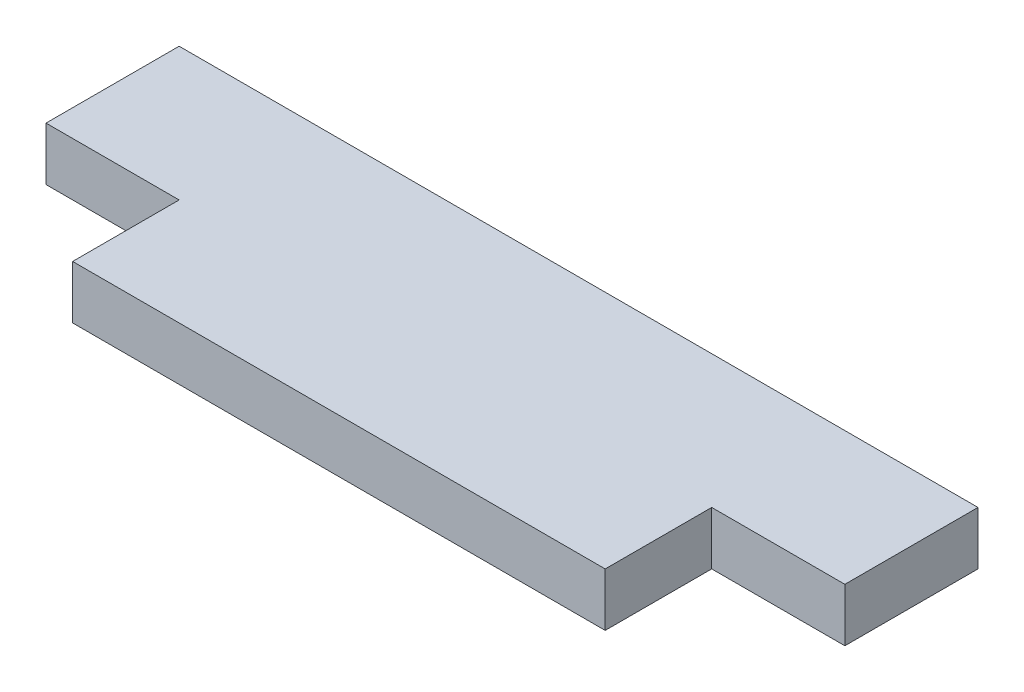
ISO-10303-21;
HEADER;
FILE_DESCRIPTION(('STEP AP214'),'2;1');
FILE_NAME('part.step','',(''),(''),'','','');
FILE_SCHEMA(('AUTOMOTIVE_DESIGN { 1 0 10303 214 1 1 1 1 }'));
ENDSEC;
DATA;
#1=APPLICATION_CONTEXT('core data for automotive mechanical design processes');
#2=APPLICATION_PROTOCOL_DEFINITION('international standard','automotive_design',2000,#1);
#3=PRODUCT_CONTEXT('',#1,'mechanical');
#4=PRODUCT('Part','Part','',(#3));
#5=PRODUCT_RELATED_PRODUCT_CATEGORY('part','',(#4));
#6=PRODUCT_DEFINITION_FORMATION('','',#4);
#7=PRODUCT_DEFINITION_CONTEXT('part definition',#1,'design');
#8=PRODUCT_DEFINITION('design','',#6,#7);
#9=PRODUCT_DEFINITION_SHAPE('','',#8);
#10=(LENGTH_UNIT() NAMED_UNIT(*) SI_UNIT(.MILLI.,.METRE.));
#11=(NAMED_UNIT(*) PLANE_ANGLE_UNIT() SI_UNIT($,.RADIAN.));
#12=(NAMED_UNIT(*) SI_UNIT($,.STERADIAN.) SOLID_ANGLE_UNIT());
#13=UNCERTAINTY_MEASURE_WITH_UNIT(LENGTH_MEASURE(1.E-05),#10,'distance_accuracy_value','');
#14=(GEOMETRIC_REPRESENTATION_CONTEXT(3) GLOBAL_UNCERTAINTY_ASSIGNED_CONTEXT((#13)) GLOBAL_UNIT_ASSIGNED_CONTEXT((#10,
#11,#12)) REPRESENTATION_CONTEXT('',''));
#15=CARTESIAN_POINT('',(0.,0.,0.));
#16=DIRECTION('',(0.,0.,1.));
#17=DIRECTION('',(1.,0.,0.));
#18=AXIS2_PLACEMENT_3D('',#15,#16,#17);
#19=CARTESIAN_POINT('',(-10.,1.,4.));
#20=DIRECTION('',(1.,0.,0.));
#21=DIRECTION('',(0.,0.,-1.));
#22=AXIS2_PLACEMENT_3D('',#19,#20,#21);
#23=PLANE('',#22);
#24=DIRECTION('',(0.,-1.,0.));
#25=VECTOR('',#24,1.);
#26=CARTESIAN_POINT('',(-10.,1.,0.));
#27=LINE('',#26,#25);
#28=CARTESIAN_POINT('',(-10.,1.,0.));
#29=VERTEX_POINT('',#28);
#30=CARTESIAN_POINT('',(-10.,-1.,0.));
#31=VERTEX_POINT('',#30);
#32=EDGE_CURVE('E120',#29,#31,#27,.T.);
#33=ORIENTED_EDGE('',*,*,#32,.T.);
#34=DIRECTION('',(0.,0.,-1.));
#35=VECTOR('',#34,1.);
#36=CARTESIAN_POINT('',(-10.,-1.,4.));
#37=LINE('',#36,#35);
#38=CARTESIAN_POINT('',(-10.,-1.,4.));
#39=VERTEX_POINT('',#38);
#40=EDGE_CURVE('E11',#39,#31,#37,.T.);
#41=ORIENTED_EDGE('',*,*,#40,.F.);
#42=DIRECTION('',(0.,-1.,0.));
#43=VECTOR('',#42,1.);
#44=CARTESIAN_POINT('',(-10.,1.,4.));
#45=LINE('',#44,#43);
#46=CARTESIAN_POINT('',(-10.,1.,4.));
#47=VERTEX_POINT('',#46);
#48=EDGE_CURVE('E129',#47,#39,#45,.T.);
#49=ORIENTED_EDGE('',*,*,#48,.F.);
#50=DIRECTION('',(0.,0.,-1.));
#51=VECTOR('',#50,1.);
#52=CARTESIAN_POINT('',(-10.,1.,4.));
#53=LINE('',#52,#51);
#54=EDGE_CURVE('E135',#47,#29,#53,.T.);
#55=ORIENTED_EDGE('',*,*,#54,.T.);
#56=EDGE_LOOP('',(#33,#41,#49,#55));
#57=FACE_BOUND('',#56,.T.);
#58=ADVANCED_FACE('F33',(#57),#23,.F.);
#59=CARTESIAN_POINT('',(-10.,-1.,4.));
#60=DIRECTION('',(0.,1.,0.));
#61=DIRECTION('',(0.,0.,1.));
#62=AXIS2_PLACEMENT_3D('',#59,#60,#61);
#63=PLANE('',#62);
#64=ORIENTED_EDGE('',*,*,#40,.T.);
#65=DIRECTION('',(-1.,0.,0.));
#66=VECTOR('',#65,1.);
#67=CARTESIAN_POINT('',(-15.,-1.,0.));
#68=LINE('',#67,#66);
#69=CARTESIAN_POINT('',(-15.,-1.,0.));
#70=VERTEX_POINT('',#69);
#71=EDGE_CURVE('E156',#31,#70,#68,.T.);
#72=ORIENTED_EDGE('',*,*,#71,.T.);
#73=DIRECTION('',(0.,0.,1.));
#74=VECTOR('',#73,1.);
#75=CARTESIAN_POINT('',(-15.,-1.,-5.));
#76=LINE('',#75,#74);
#77=CARTESIAN_POINT('',(-15.,-1.,-5.));
#78=VERTEX_POINT('',#77);
#79=EDGE_CURVE('E162',#78,#70,#76,.T.);
#80=ORIENTED_EDGE('',*,*,#79,.F.);
#81=DIRECTION('',(-1.,0.,0.));
#82=VECTOR('',#81,1.);
#83=CARTESIAN_POINT('',(-15.,-1.,-5.));
#84=LINE('',#83,#82);
#85=CARTESIAN_POINT('',(15.,-1.,-5.));
#86=VERTEX_POINT('',#85);
#87=EDGE_CURVE('E111',#86,#78,#84,.T.);
#88=ORIENTED_EDGE('',*,*,#87,.F.);
#89=DIRECTION('',(0.,0.,1.));
#90=VECTOR('',#89,1.);
#91=CARTESIAN_POINT('',(15.,-1.,-5.));
#92=LINE('',#91,#90);
#93=CARTESIAN_POINT('',(15.,-1.,0.));
#94=VERTEX_POINT('',#93);
#95=EDGE_CURVE('E125',#86,#94,#92,.T.);
#96=ORIENTED_EDGE('',*,*,#95,.T.);
#97=CARTESIAN_POINT('',(10.,-1.,0.));
#98=VERTEX_POINT('',#97);
#99=EDGE_CURVE('E115',#94,#98,#68,.T.);
#100=ORIENTED_EDGE('',*,*,#99,.T.);
#101=DIRECTION('',(0.,0.,-1.));
#102=VECTOR('',#101,1.);
#103=CARTESIAN_POINT('',(10.,-1.,4.));
#104=LINE('',#103,#102);
#105=CARTESIAN_POINT('',(10.,-1.,4.));
#106=VERTEX_POINT('',#105);
#107=EDGE_CURVE('E41',#106,#98,#104,.T.);
#108=ORIENTED_EDGE('',*,*,#107,.F.);
#109=DIRECTION('',(1.,0.,0.));
#110=VECTOR('',#109,1.);
#111=CARTESIAN_POINT('',(-10.,-1.,4.));
#112=LINE('',#111,#110);
#113=EDGE_CURVE('E131',#39,#106,#112,.T.);
#114=ORIENTED_EDGE('',*,*,#113,.F.);
#115=EDGE_LOOP('',(#64,#72,#80,#88,#96,#100,#108,#114));
#116=FACE_BOUND('',#115,.T.);
#117=ADVANCED_FACE('F150',(#116),#63,.F.);
#118=CARTESIAN_POINT('',(10.,1.,4.));
#119=DIRECTION('',(-1.,0.,0.));
#120=DIRECTION('',(0.,0.,1.));
#121=AXIS2_PLACEMENT_3D('',#118,#119,#120);
#122=PLANE('',#121);
#123=DIRECTION('',(0.,1.,0.));
#124=VECTOR('',#123,1.);
#125=CARTESIAN_POINT('',(10.,1.,0.));
#126=LINE('',#125,#124);
#127=CARTESIAN_POINT('',(10.,1.,0.));
#128=VERTEX_POINT('',#127);
#129=EDGE_CURVE('E123',#98,#128,#126,.T.);
#130=ORIENTED_EDGE('',*,*,#129,.T.);
#131=DIRECTION('',(0.,0.,-1.));
#132=VECTOR('',#131,1.);
#133=CARTESIAN_POINT('',(10.,1.,4.));
#134=LINE('',#133,#132);
#135=CARTESIAN_POINT('',(10.,1.,4.));
#136=VERTEX_POINT('',#135);
#137=EDGE_CURVE('E141',#136,#128,#134,.T.);
#138=ORIENTED_EDGE('',*,*,#137,.F.);
#139=DIRECTION('',(0.,1.,0.));
#140=VECTOR('',#139,1.);
#141=CARTESIAN_POINT('',(10.,1.,4.));
#142=LINE('',#141,#140);
#143=EDGE_CURVE('E133',#106,#136,#142,.T.);
#144=ORIENTED_EDGE('',*,*,#143,.F.);
#145=ORIENTED_EDGE('',*,*,#107,.T.);
#146=EDGE_LOOP('',(#130,#138,#144,#145));
#147=FACE_BOUND('',#146,.T.);
#148=ADVANCED_FACE('F146',(#147),#122,.F.);
#149=CARTESIAN_POINT('',(-10.,1.,4.));
#150=DIRECTION('',(0.,-1.,0.));
#151=DIRECTION('',(1.,0.,0.));
#152=AXIS2_PLACEMENT_3D('',#149,#150,#151);
#153=PLANE('',#152);
#154=ORIENTED_EDGE('',*,*,#137,.T.);
#155=DIRECTION('',(1.,0.,0.));
#156=VECTOR('',#155,1.);
#157=CARTESIAN_POINT('',(-15.,1.,0.));
#158=LINE('',#157,#156);
#159=CARTESIAN_POINT('',(15.,0.999999999999997,0.));
#160=VERTEX_POINT('',#159);
#161=EDGE_CURVE('E166',#128,#160,#158,.T.);
#162=ORIENTED_EDGE('',*,*,#161,.T.);
#163=DIRECTION('',(0.,0.,1.));
#164=VECTOR('',#163,1.);
#165=CARTESIAN_POINT('',(15.,0.999999999999997,-5.));
#166=LINE('',#165,#164);
#167=CARTESIAN_POINT('',(15.,0.999999999999997,-5.));
#168=VERTEX_POINT('',#167);
#169=EDGE_CURVE('E102',#168,#160,#166,.T.);
#170=ORIENTED_EDGE('',*,*,#169,.F.);
#171=DIRECTION('',(1.,0.,0.));
#172=VECTOR('',#171,1.);
#173=CARTESIAN_POINT('',(-15.,1.,-5.));
#174=LINE('',#173,#172);
#175=CARTESIAN_POINT('',(-15.,1.,-5.));
#176=VERTEX_POINT('',#175);
#177=EDGE_CURVE('E93',#176,#168,#174,.T.);
#178=ORIENTED_EDGE('',*,*,#177,.F.);
#179=DIRECTION('',(0.,0.,1.));
#180=VECTOR('',#179,1.);
#181=CARTESIAN_POINT('',(-15.,1.,-5.));
#182=LINE('',#181,#180);
#183=CARTESIAN_POINT('',(-15.,1.,0.));
#184=VERTEX_POINT('',#183);
#185=EDGE_CURVE('E99',#176,#184,#182,.T.);
#186=ORIENTED_EDGE('',*,*,#185,.T.);
#187=EDGE_CURVE('E167',#184,#29,#158,.T.);
#188=ORIENTED_EDGE('',*,*,#187,.T.);
#189=ORIENTED_EDGE('',*,*,#54,.F.);
#190=DIRECTION('',(-1.,0.,0.));
#191=VECTOR('',#190,1.);
#192=CARTESIAN_POINT('',(-10.,1.,4.));
#193=LINE('',#192,#191);
#194=EDGE_CURVE('E48',#136,#47,#193,.T.);
#195=ORIENTED_EDGE('',*,*,#194,.F.);
#196=EDGE_LOOP('',(#154,#162,#170,#178,#186,#188,#189,#195));
#197=FACE_BOUND('',#196,.T.);
#198=ADVANCED_FACE('F96',(#197),#153,.F.);
#199=CARTESIAN_POINT('',(0.,0.,4.));
#200=DIRECTION('',(0.,0.,1.));
#201=DIRECTION('',(1.,0.,0.));
#202=AXIS2_PLACEMENT_3D('',#199,#200,#201);
#203=PLANE('',#202);
#204=ORIENTED_EDGE('',*,*,#48,.T.);
#205=ORIENTED_EDGE('',*,*,#113,.T.);
#206=ORIENTED_EDGE('',*,*,#143,.T.);
#207=ORIENTED_EDGE('',*,*,#194,.T.);
#208=EDGE_LOOP('',(#204,#205,#206,#207));
#209=FACE_BOUND('',#208,.T.);
#210=ADVANCED_FACE('F180',(#209),#203,.T.);
#211=CARTESIAN_POINT('',(0.,0.,0.));
#212=DIRECTION('',(0.,0.,1.));
#213=DIRECTION('',(1.,0.,0.));
#214=AXIS2_PLACEMENT_3D('',#211,#212,#213);
#215=PLANE('',#214);
#216=ORIENTED_EDGE('',*,*,#32,.F.);
#217=ORIENTED_EDGE('',*,*,#187,.F.);
#218=DIRECTION('',(0.,1.,0.));
#219=VECTOR('',#218,1.);
#220=CARTESIAN_POINT('',(-15.,1.,0.));
#221=LINE('',#220,#219);
#222=EDGE_CURVE('E119',#70,#184,#221,.T.);
#223=ORIENTED_EDGE('',*,*,#222,.F.);
#224=ORIENTED_EDGE('',*,*,#71,.F.);
#225=EDGE_LOOP('',(#216,#217,#223,#224));
#226=FACE_BOUND('',#225,.T.);
#227=ADVANCED_FACE('F173',(#226),#215,.T.);
#228=ORIENTED_EDGE('',*,*,#129,.F.);
#229=ORIENTED_EDGE('',*,*,#99,.F.);
#230=DIRECTION('',(0.,-1.,0.));
#231=VECTOR('',#230,1.);
#232=CARTESIAN_POINT('',(15.,0.999999999999997,0.));
#233=LINE('',#232,#231);
#234=EDGE_CURVE('E158',#160,#94,#233,.T.);
#235=ORIENTED_EDGE('',*,*,#234,.F.);
#236=ORIENTED_EDGE('',*,*,#161,.F.);
#237=EDGE_LOOP('',(#228,#229,#235,#236));
#238=FACE_BOUND('',#237,.T.);
#239=ADVANCED_FACE('F171',(#238),#215,.T.);
#240=CARTESIAN_POINT('',(-15.,1.,-5.));
#241=DIRECTION('',(1.,0.,0.));
#242=DIRECTION('',(0.,0.,-1.));
#243=AXIS2_PLACEMENT_3D('',#240,#241,#242);
#244=PLANE('',#243);
#245=ORIENTED_EDGE('',*,*,#222,.T.);
#246=ORIENTED_EDGE('',*,*,#185,.F.);
#247=DIRECTION('',(0.,1.,0.));
#248=VECTOR('',#247,1.);
#249=CARTESIAN_POINT('',(-15.,1.,-5.));
#250=LINE('',#249,#248);
#251=EDGE_CURVE('E106',#78,#176,#250,.T.);
#252=ORIENTED_EDGE('',*,*,#251,.F.);
#253=ORIENTED_EDGE('',*,*,#79,.T.);
#254=EDGE_LOOP('',(#245,#246,#252,#253));
#255=FACE_BOUND('',#254,.T.);
#256=ADVANCED_FACE('F117',(#255),#244,.F.);
#257=CARTESIAN_POINT('',(15.,0.999999999999997,-5.));
#258=DIRECTION('',(-1.,0.,0.));
#259=DIRECTION('',(0.,0.,1.));
#260=AXIS2_PLACEMENT_3D('',#257,#258,#259);
#261=PLANE('',#260);
#262=ORIENTED_EDGE('',*,*,#234,.T.);
#263=ORIENTED_EDGE('',*,*,#95,.F.);
#264=DIRECTION('',(0.,-1.,0.));
#265=VECTOR('',#264,1.);
#266=CARTESIAN_POINT('',(15.,0.999999999999997,-5.));
#267=LINE('',#266,#265);
#268=EDGE_CURVE('E105',#168,#86,#267,.T.);
#269=ORIENTED_EDGE('',*,*,#268,.F.);
#270=ORIENTED_EDGE('',*,*,#169,.T.);
#271=EDGE_LOOP('',(#262,#263,#269,#270));
#272=FACE_BOUND('',#271,.T.);
#273=ADVANCED_FACE('F170',(#272),#261,.F.);
#274=CARTESIAN_POINT('',(0.,0.,-5.));
#275=DIRECTION('',(0.,0.,1.));
#276=DIRECTION('',(1.,0.,0.));
#277=AXIS2_PLACEMENT_3D('',#274,#275,#276);
#278=PLANE('',#277);
#279=ORIENTED_EDGE('',*,*,#251,.T.);
#280=ORIENTED_EDGE('',*,*,#177,.T.);
#281=ORIENTED_EDGE('',*,*,#268,.T.);
#282=ORIENTED_EDGE('',*,*,#87,.T.);
#283=EDGE_LOOP('',(#279,#280,#281,#282));
#284=FACE_BOUND('',#283,.T.);
#285=ADVANCED_FACE('F109',(#284),#278,.F.);
#286=CLOSED_SHELL('',(#58,#117,#148,#198,#210,#227,#239,#256,#273,#285));
#287=MANIFOLD_SOLID_BREP('B2',#286);
#288=ADVANCED_BREP_SHAPE_REPRESENTATION('',(#18,#287),#14);
#289=SHAPE_DEFINITION_REPRESENTATION(#9,#288);
ENDSEC;
END-ISO-10303-21;
